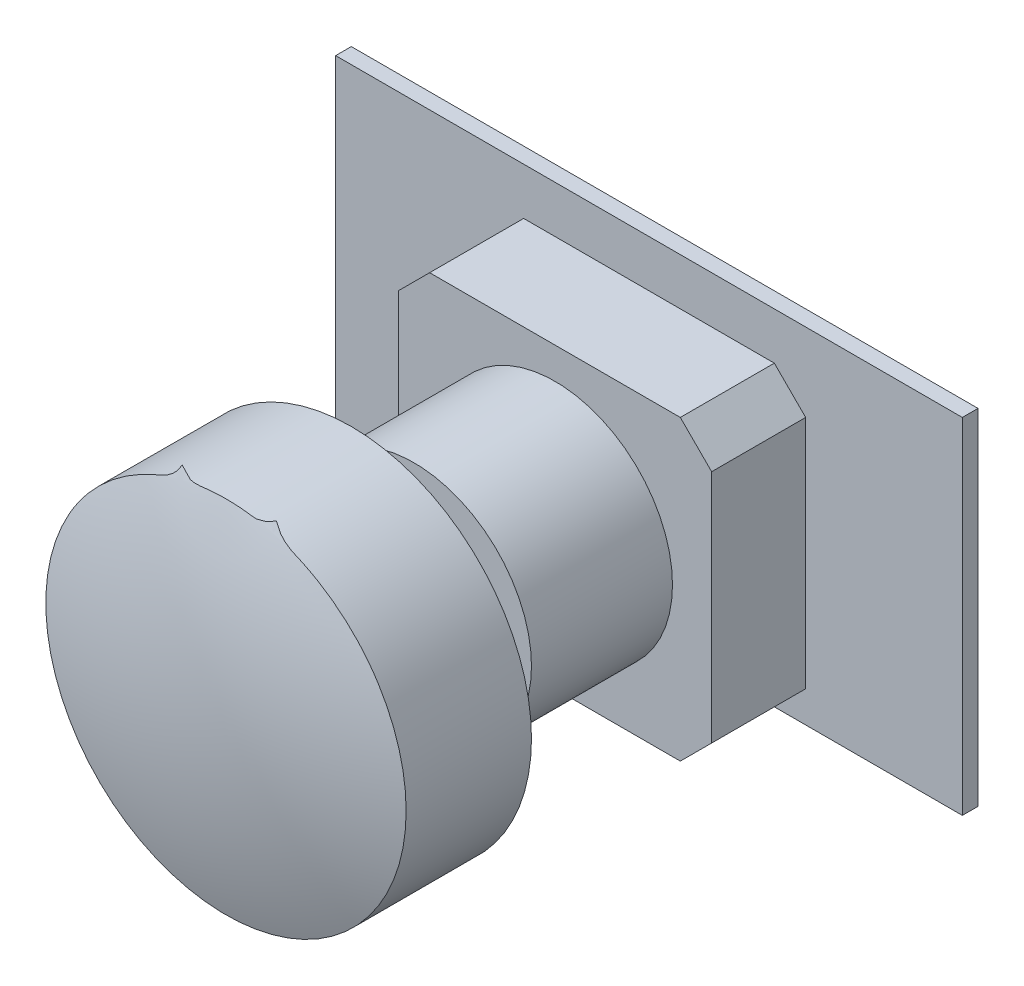
ISO-10303-21;
HEADER;
FILE_DESCRIPTION(('STEP AP214'),'2;1');
FILE_NAME('part.step','',(''),(''),'','','');
FILE_SCHEMA(('AUTOMOTIVE_DESIGN { 1 0 10303 214 1 1 1 1 }'));
ENDSEC;
DATA;
#1=APPLICATION_CONTEXT('core data for automotive mechanical design processes');
#2=APPLICATION_PROTOCOL_DEFINITION('international standard','automotive_design',2000,#1);
#3=PRODUCT_CONTEXT('',#1,'mechanical');
#4=PRODUCT('Part','Part','',(#3));
#5=PRODUCT_RELATED_PRODUCT_CATEGORY('part','',(#4));
#6=PRODUCT_DEFINITION_FORMATION('','',#4);
#7=PRODUCT_DEFINITION_CONTEXT('part definition',#1,'design');
#8=PRODUCT_DEFINITION('design','',#6,#7);
#9=PRODUCT_DEFINITION_SHAPE('','',#8);
#10=(LENGTH_UNIT() NAMED_UNIT(*) SI_UNIT(.MILLI.,.METRE.));
#11=(NAMED_UNIT(*) PLANE_ANGLE_UNIT() SI_UNIT($,.RADIAN.));
#12=(NAMED_UNIT(*) SI_UNIT($,.STERADIAN.) SOLID_ANGLE_UNIT());
#13=UNCERTAINTY_MEASURE_WITH_UNIT(LENGTH_MEASURE(1.E-05),#10,'distance_accuracy_value','');
#14=(GEOMETRIC_REPRESENTATION_CONTEXT(3) GLOBAL_UNCERTAINTY_ASSIGNED_CONTEXT((#13)) GLOBAL_UNIT_ASSIGNED_CONTEXT((#10,
#11,#12)) REPRESENTATION_CONTEXT('',''));
#15=CARTESIAN_POINT('',(0.,0.,0.));
#16=DIRECTION('',(0.,0.,1.));
#17=DIRECTION('',(1.,0.,0.));
#18=AXIS2_PLACEMENT_3D('',#15,#16,#17);
#19=CARTESIAN_POINT('',(20.,9.5,17.));
#20=DIRECTION('',(0.,0.,-1.));
#21=DIRECTION('',(-1.,0.,0.));
#22=AXIS2_PLACEMENT_3D('',#19,#20,#21);
#23=PLANE('',#22);
#24=CARTESIAN_POINT('',(20.,9.5,17.));
#25=DIRECTION('',(0.,0.,-1.));
#26=DIRECTION('',(-1.,0.,0.));
#27=AXIS2_PLACEMENT_3D('',#24,#25,#26);
#28=CIRCLE('',#27,6.);
#29=CARTESIAN_POINT('',(14.,9.5,17.));
#30=VERTEX_POINT('',#29);
#31=EDGE_CURVE('E196',#30,#30,#28,.T.);
#32=ORIENTED_EDGE('',*,*,#31,.T.);
#33=EDGE_LOOP('',(#32));
#34=FACE_BOUND('',#33,.T.);
#35=CARTESIAN_POINT('',(20.,9.5,17.));
#36=DIRECTION('',(0.,0.,-1.));
#37=DIRECTION('',(-1.,0.,0.));
#38=AXIS2_PLACEMENT_3D('',#35,#36,#37);
#39=CIRCLE('',#38,4.5);
#40=CARTESIAN_POINT('',(15.5,9.5,17.));
#41=VERTEX_POINT('',#40);
#42=EDGE_CURVE('E189',#41,#41,#39,.T.);
#43=ORIENTED_EDGE('',*,*,#42,.F.);
#44=EDGE_LOOP('',(#43));
#45=FACE_BOUND('',#44,.T.);
#46=ADVANCED_FACE('F45',(#34,#45),#23,.T.);
#47=CARTESIAN_POINT('',(20.,9.5,20.));
#48=DIRECTION('',(0.,0.,-1.));
#49=DIRECTION('',(-1.,0.,0.));
#50=AXIS2_PLACEMENT_3D('',#47,#48,#49);
#51=PLANE('',#50);
#52=CARTESIAN_POINT('',(20.,9.5,20.));
#53=DIRECTION('',(0.,0.,-1.));
#54=DIRECTION('',(-1.,0.,0.));
#55=AXIS2_PLACEMENT_3D('',#52,#53,#54);
#56=CIRCLE('',#55,11.5);
#57=CARTESIAN_POINT('',(8.49999999999999,9.5,20.));
#58=VERTEX_POINT('',#57);
#59=EDGE_CURVE('E199',#58,#58,#56,.T.);
#60=ORIENTED_EDGE('',*,*,#59,.T.);
#61=EDGE_LOOP('',(#60));
#62=FACE_BOUND('',#61,.T.);
#63=CARTESIAN_POINT('',(20.,9.5,20.));
#64=DIRECTION('',(0.,0.,-1.));
#65=DIRECTION('',(-1.,0.,0.));
#66=AXIS2_PLACEMENT_3D('',#63,#64,#65);
#67=CIRCLE('',#66,6.);
#68=CARTESIAN_POINT('',(14.,9.5,20.));
#69=VERTEX_POINT('',#68);
#70=EDGE_CURVE('E193',#69,#69,#67,.T.);
#71=ORIENTED_EDGE('',*,*,#70,.F.);
#72=EDGE_LOOP('',(#71));
#73=FACE_BOUND('',#72,.T.);
#74=ADVANCED_FACE('F218',(#62,#73),#51,.T.);
#75=CARTESIAN_POINT('',(20.,9.50000000000002,-5.51802680000016));
#76=DIRECTION('',(0.,0.330546873924251,0.94378957619742));
#77=DIRECTION('',(-1.,0.,0.));
#78=AXIS2_PLACEMENT_3D('',#75,#76,#77);
#79=SPHERICAL_SURFACE('',#78,35.4359721267179);
#80=CARTESIAN_POINT('',(20.,9.5,28.));
#81=DIRECTION('',(0.,0.,1.));
#82=DIRECTION('',(1.,0.,0.));
#83=AXIS2_PLACEMENT_3D('',#80,#81,#82);
#84=CIRCLE('',#83,11.5);
#85=CARTESIAN_POINT('',(31.5,9.5,28.));
#86=VERTEX_POINT('',#85);
#87=EDGE_CURVE('E204',#86,#86,#84,.F.);
#88=ORIENTED_EDGE('',*,*,#87,.F.);
#89=EDGE_LOOP('',(#88));
#90=FACE_BOUND('',#89,.T.);
#91=ADVANCED_FACE('F213',(#90),#79,.T.);
#92=CARTESIAN_POINT('',(20.,9.5,20.));
#93=DIRECTION('',(0.,0.,1.));
#94=DIRECTION('',(1.,0.,0.));
#95=AXIS2_PLACEMENT_3D('',#92,#93,#94);
#96=CYLINDRICAL_SURFACE('',#95,11.5);
#97=ORIENTED_EDGE('',*,*,#59,.F.);
#98=EDGE_LOOP('',(#97));
#99=FACE_BOUND('',#98,.T.);
#100=ORIENTED_EDGE('',*,*,#87,.T.);
#101=EDGE_LOOP('',(#100));
#102=FACE_BOUND('',#101,.T.);
#103=ADVANCED_FACE('F217',(#99,#102),#96,.T.);
#104=CARTESIAN_POINT('',(20.,9.5,17.));
#105=DIRECTION('',(0.,0.,1.));
#106=DIRECTION('',(1.,0.,0.));
#107=AXIS2_PLACEMENT_3D('',#104,#105,#106);
#108=CYLINDRICAL_SURFACE('',#107,6.);
#109=ORIENTED_EDGE('',*,*,#31,.F.);
#110=EDGE_LOOP('',(#109));
#111=FACE_BOUND('',#110,.T.);
#112=ORIENTED_EDGE('',*,*,#70,.T.);
#113=EDGE_LOOP('',(#112));
#114=FACE_BOUND('',#113,.T.);
#115=ADVANCED_FACE('F249',(#111,#114),#108,.T.);
#116=CARTESIAN_POINT('',(20.,9.5,16.));
#117=DIRECTION('',(0.,0.,1.));
#118=DIRECTION('',(1.,0.,0.));
#119=AXIS2_PLACEMENT_3D('',#116,#117,#118);
#120=CYLINDRICAL_SURFACE('',#119,4.5);
#121=CARTESIAN_POINT('',(20.,9.5,16.));
#122=DIRECTION('',(0.,0.,-1.));
#123=DIRECTION('',(-1.,0.,0.));
#124=AXIS2_PLACEMENT_3D('',#121,#122,#123);
#125=CIRCLE('',#124,4.5);
#126=CARTESIAN_POINT('',(15.5,9.5,16.));
#127=VERTEX_POINT('',#126);
#128=EDGE_CURVE('E190',#127,#127,#125,.T.);
#129=ORIENTED_EDGE('',*,*,#128,.F.);
#130=EDGE_LOOP('',(#129));
#131=FACE_BOUND('',#130,.T.);
#132=ORIENTED_EDGE('',*,*,#42,.T.);
#133=EDGE_LOOP('',(#132));
#134=FACE_BOUND('',#133,.T.);
#135=ADVANCED_FACE('F247',(#131,#134),#120,.T.);
#136=CARTESIAN_POINT('',(20.,9.5,16.));
#137=DIRECTION('',(0.,0.,-1.));
#138=DIRECTION('',(-1.,0.,0.));
#139=AXIS2_PLACEMENT_3D('',#136,#137,#138);
#140=PLANE('',#139);
#141=CARTESIAN_POINT('',(20.,9.5,16.));
#142=DIRECTION('',(0.,0.,1.));
#143=DIRECTION('',(-1.,0.,0.));
#144=AXIS2_PLACEMENT_3D('',#141,#142,#143);
#145=CIRCLE('',#144,7.5);
#146=CARTESIAN_POINT('',(12.5,9.5,16.));
#147=VERTEX_POINT('',#146);
#148=EDGE_CURVE('E186',#147,#147,#145,.T.);
#149=ORIENTED_EDGE('',*,*,#148,.T.);
#150=EDGE_LOOP('',(#149));
#151=FACE_BOUND('',#150,.T.);
#152=ORIENTED_EDGE('',*,*,#128,.T.);
#153=EDGE_LOOP('',(#152));
#154=FACE_BOUND('',#153,.T.);
#155=ADVANCED_FACE('F256',(#151,#154),#140,.F.);
#156=CARTESIAN_POINT('',(20.,9.5,7.));
#157=DIRECTION('',(0.,0.,1.));
#158=DIRECTION('',(1.,0.,0.));
#159=AXIS2_PLACEMENT_3D('',#156,#157,#158);
#160=CYLINDRICAL_SURFACE('',#159,7.5);
#161=CARTESIAN_POINT('',(20.,9.5,7.));
#162=DIRECTION('',(0.,0.,1.));
#163=DIRECTION('',(1.,0.,0.));
#164=AXIS2_PLACEMENT_3D('',#161,#162,#163);
#165=CIRCLE('',#164,7.5);
#166=CARTESIAN_POINT('',(27.5,9.5,7.));
#167=VERTEX_POINT('',#166);
#168=EDGE_CURVE('E183',#167,#167,#165,.F.);
#169=ORIENTED_EDGE('',*,*,#168,.F.);
#170=EDGE_LOOP('',(#169));
#171=FACE_BOUND('',#170,.T.);
#172=ORIENTED_EDGE('',*,*,#148,.F.);
#173=EDGE_LOOP('',(#172));
#174=FACE_BOUND('',#173,.T.);
#175=ADVANCED_FACE('F301',(#171,#174),#160,.T.);
#176=CARTESIAN_POINT('',(40.,19.,0.));
#177=DIRECTION('',(0.,1.,0.));
#178=DIRECTION('',(0.,0.,1.));
#179=AXIS2_PLACEMENT_3D('',#176,#177,#178);
#180=PLANE('',#179);
#181=DIRECTION('',(-1.,0.,0.));
#182=VECTOR('',#181,1.);
#183=CARTESIAN_POINT('',(40.,19.,7.));
#184=LINE('',#183,#182);
#185=CARTESIAN_POINT('',(28.,19.,7.));
#186=VERTEX_POINT('',#185);
#187=CARTESIAN_POINT('',(12.,19.,7.));
#188=VERTEX_POINT('',#187);
#189=EDGE_CURVE('E159',#186,#188,#184,.T.);
#190=ORIENTED_EDGE('',*,*,#189,.F.);
#191=DIRECTION('',(0.,0.,-1.));
#192=VECTOR('',#191,1.);
#193=CARTESIAN_POINT('',(28.,19.,1.));
#194=LINE('',#193,#192);
#195=CARTESIAN_POINT('',(28.,19.,1.));
#196=VERTEX_POINT('',#195);
#197=EDGE_CURVE('E60',#186,#196,#194,.T.);
#198=ORIENTED_EDGE('',*,*,#197,.T.);
#199=DIRECTION('',(1.,0.,0.));
#200=VECTOR('',#199,1.);
#201=CARTESIAN_POINT('',(40.,19.,1.));
#202=LINE('',#201,#200);
#203=CARTESIAN_POINT('',(12.,19.,1.));
#204=VERTEX_POINT('',#203);
#205=EDGE_CURVE('E166',#204,#196,#202,.T.);
#206=ORIENTED_EDGE('',*,*,#205,.F.);
#207=DIRECTION('',(0.,0.,1.));
#208=VECTOR('',#207,1.);
#209=CARTESIAN_POINT('',(12.,19.,0.));
#210=LINE('',#209,#208);
#211=EDGE_CURVE('E500',#204,#188,#210,.T.);
#212=ORIENTED_EDGE('',*,*,#211,.T.);
#213=EDGE_LOOP('',(#190,#198,#206,#212));
#214=FACE_BOUND('',#213,.T.);
#215=ADVANCED_FACE('F311',(#214),#180,.T.);
#216=CARTESIAN_POINT('',(40.,0.,0.));
#217=DIRECTION('',(1.,0.,0.));
#218=DIRECTION('',(0.,0.,-1.));
#219=AXIS2_PLACEMENT_3D('',#216,#217,#218);
#220=PLANE('',#219);
#221=DIRECTION('',(0.,0.,-1.));
#222=VECTOR('',#221,1.);
#223=CARTESIAN_POINT('',(40.,22.,0.));
#224=LINE('',#223,#222);
#225=CARTESIAN_POINT('',(40.,22.,1.));
#226=VERTEX_POINT('',#225);
#227=CARTESIAN_POINT('',(40.,22.,0.));
#228=VERTEX_POINT('',#227);
#229=EDGE_CURVE('E139',#226,#228,#224,.T.);
#230=ORIENTED_EDGE('',*,*,#229,.F.);
#231=DIRECTION('',(0.,1.,0.));
#232=VECTOR('',#231,1.);
#233=CARTESIAN_POINT('',(40.,-2.15420758550672,1.));
#234=LINE('',#233,#232);
#235=CARTESIAN_POINT('',(40.,0.,1.));
#236=VERTEX_POINT('',#235);
#237=EDGE_CURVE('E150',#236,#226,#234,.T.);
#238=ORIENTED_EDGE('',*,*,#237,.F.);
#239=DIRECTION('',(0.,0.,1.));
#240=VECTOR('',#239,1.);
#241=CARTESIAN_POINT('',(40.,0.,0.));
#242=LINE('',#241,#240);
#243=CARTESIAN_POINT('',(40.,0.,0.));
#244=VERTEX_POINT('',#243);
#245=EDGE_CURVE('E176',#244,#236,#242,.T.);
#246=ORIENTED_EDGE('',*,*,#245,.F.);
#247=DIRECTION('',(0.,1.,0.));
#248=VECTOR('',#247,1.);
#249=CARTESIAN_POINT('',(40.,0.,0.));
#250=LINE('',#249,#248);
#251=EDGE_CURVE('E153',#244,#228,#250,.T.);
#252=ORIENTED_EDGE('',*,*,#251,.T.);
#253=EDGE_LOOP('',(#230,#238,#246,#252));
#254=FACE_BOUND('',#253,.T.);
#255=ADVANCED_FACE('F149',(#254),#220,.T.);
#256=CARTESIAN_POINT('',(10.,0.,0.));
#257=DIRECTION('',(0.,-1.,0.));
#258=DIRECTION('',(1.,0.,0.));
#259=AXIS2_PLACEMENT_3D('',#256,#257,#258);
#260=PLANE('',#259);
#261=DIRECTION('',(1.,0.,0.));
#262=VECTOR('',#261,1.);
#263=CARTESIAN_POINT('',(10.,0.,7.));
#264=LINE('',#263,#262);
#265=CARTESIAN_POINT('',(12.,0.,7.));
#266=VERTEX_POINT('',#265);
#267=CARTESIAN_POINT('',(28.,0.,7.));
#268=VERTEX_POINT('',#267);
#269=EDGE_CURVE('E175',#266,#268,#264,.T.);
#270=ORIENTED_EDGE('',*,*,#269,.F.);
#271=DIRECTION('',(0.,0.,-1.));
#272=VECTOR('',#271,1.);
#273=CARTESIAN_POINT('',(12.,0.,0.));
#274=LINE('',#273,#272);
#275=CARTESIAN_POINT('',(12.,0.,1.));
#276=VERTEX_POINT('',#275);
#277=EDGE_CURVE('E490',#266,#276,#274,.T.);
#278=ORIENTED_EDGE('',*,*,#277,.T.);
#279=DIRECTION('',(1.,0.,0.));
#280=VECTOR('',#279,1.);
#281=CARTESIAN_POINT('',(0.,0.,1.));
#282=LINE('',#281,#280);
#283=CARTESIAN_POINT('',(0.,0.,1.));
#284=VERTEX_POINT('',#283);
#285=EDGE_CURVE('E144',#284,#276,#282,.T.);
#286=ORIENTED_EDGE('',*,*,#285,.F.);
#287=DIRECTION('',(0.,0.,1.));
#288=VECTOR('',#287,1.);
#289=CARTESIAN_POINT('',(0.,0.,1.));
#290=LINE('',#289,#288);
#291=CARTESIAN_POINT('',(0.,0.,0.));
#292=VERTEX_POINT('',#291);
#293=EDGE_CURVE('E480',#292,#284,#290,.T.);
#294=ORIENTED_EDGE('',*,*,#293,.F.);
#295=DIRECTION('',(1.,0.,0.));
#296=VECTOR('',#295,1.);
#297=CARTESIAN_POINT('',(10.,0.,0.));
#298=LINE('',#297,#296);
#299=EDGE_CURVE('E172',#292,#244,#298,.T.);
#300=ORIENTED_EDGE('',*,*,#299,.T.);
#301=ORIENTED_EDGE('',*,*,#245,.T.);
#302=DIRECTION('',(1.,0.,0.));
#303=VECTOR('',#302,1.);
#304=CARTESIAN_POINT('',(10.,0.,1.));
#305=LINE('',#304,#303);
#306=CARTESIAN_POINT('',(28.,0.,1.));
#307=VERTEX_POINT('',#306);
#308=EDGE_CURVE('E158',#307,#236,#305,.T.);
#309=ORIENTED_EDGE('',*,*,#308,.F.);
#310=DIRECTION('',(0.,0.,1.));
#311=VECTOR('',#310,1.);
#312=CARTESIAN_POINT('',(28.,0.,7.));
#313=LINE('',#312,#311);
#314=EDGE_CURVE('E492',#307,#268,#313,.T.);
#315=ORIENTED_EDGE('',*,*,#314,.T.);
#316=EDGE_LOOP('',(#270,#278,#286,#294,#300,#301,#309,#315));
#317=FACE_BOUND('',#316,.T.);
#318=ADVANCED_FACE('F339',(#317),#260,.T.);
#319=CARTESIAN_POINT('',(10.,19.,0.));
#320=DIRECTION('',(-1.,0.,0.));
#321=DIRECTION('',(0.,0.,1.));
#322=AXIS2_PLACEMENT_3D('',#319,#320,#321);
#323=PLANE('',#322);
#324=DIRECTION('',(0.,1.,0.));
#325=VECTOR('',#324,1.);
#326=CARTESIAN_POINT('',(10.,22.,0.999999999999997));
#327=LINE('',#326,#325);
#328=CARTESIAN_POINT('',(10.,1.99999999999997,1.));
#329=VERTEX_POINT('',#328);
#330=CARTESIAN_POINT('',(10.,17.,0.999999999999998));
#331=VERTEX_POINT('',#330);
#332=EDGE_CURVE('E154',#329,#331,#327,.T.);
#333=ORIENTED_EDGE('',*,*,#332,.F.);
#334=DIRECTION('',(0.,0.,1.));
#335=VECTOR('',#334,1.);
#336=CARTESIAN_POINT('',(10.,1.99999999999997,0.));
#337=LINE('',#336,#335);
#338=CARTESIAN_POINT('',(10.,1.99999999999998,7.));
#339=VERTEX_POINT('',#338);
#340=EDGE_CURVE('E496',#329,#339,#337,.T.);
#341=ORIENTED_EDGE('',*,*,#340,.T.);
#342=DIRECTION('',(0.,-1.,0.));
#343=VECTOR('',#342,1.);
#344=CARTESIAN_POINT('',(10.,19.,7.));
#345=LINE('',#344,#343);
#346=CARTESIAN_POINT('',(10.,17.,7.));
#347=VERTEX_POINT('',#346);
#348=EDGE_CURVE('E163',#347,#339,#345,.T.);
#349=ORIENTED_EDGE('',*,*,#348,.F.);
#350=DIRECTION('',(0.,0.,-1.));
#351=VECTOR('',#350,1.);
#352=CARTESIAN_POINT('',(10.,17.,0.));
#353=LINE('',#352,#351);
#354=EDGE_CURVE('E475',#347,#331,#353,.T.);
#355=ORIENTED_EDGE('',*,*,#354,.T.);
#356=EDGE_LOOP('',(#333,#341,#349,#355));
#357=FACE_BOUND('',#356,.T.);
#358=ADVANCED_FACE('F345',(#357),#323,.T.);
#359=CARTESIAN_POINT('',(0.,0.,0.));
#360=DIRECTION('',(0.,0.,1.));
#361=DIRECTION('',(1.,0.,0.));
#362=AXIS2_PLACEMENT_3D('',#359,#360,#361);
#363=PLANE('',#362);
#364=DIRECTION('',(1.,0.,0.));
#365=VECTOR('',#364,1.);
#366=CARTESIAN_POINT('',(0.,22.,0.));
#367=LINE('',#366,#365);
#368=CARTESIAN_POINT('',(0.,22.,0.));
#369=VERTEX_POINT('',#368);
#370=EDGE_CURVE('E145',#369,#228,#367,.T.);
#371=ORIENTED_EDGE('',*,*,#370,.T.);
#372=ORIENTED_EDGE('',*,*,#251,.F.);
#373=ORIENTED_EDGE('',*,*,#299,.F.);
#374=DIRECTION('',(0.,-1.,0.));
#375=VECTOR('',#374,1.);
#376=CARTESIAN_POINT('',(0.,0.,0.));
#377=LINE('',#376,#375);
#378=EDGE_CURVE('E462',#369,#292,#377,.T.);
#379=ORIENTED_EDGE('',*,*,#378,.F.);
#380=EDGE_LOOP('',(#371,#372,#373,#379));
#381=FACE_BOUND('',#380,.T.);
#382=ADVANCED_FACE('F359',(#381),#363,.F.);
#383=CARTESIAN_POINT('',(0.,0.,7.));
#384=DIRECTION('',(0.,0.,1.));
#385=DIRECTION('',(1.,0.,0.));
#386=AXIS2_PLACEMENT_3D('',#383,#384,#385);
#387=PLANE('',#386);
#388=ORIENTED_EDGE('',*,*,#348,.T.);
#389=DIRECTION('',(-0.707106781186554,0.707106781186542,0.));
#390=VECTOR('',#389,1.);
#391=CARTESIAN_POINT('',(5.99999999999991,6.00000000000001,7.));
#392=LINE('',#391,#390);
#393=EDGE_CURVE('E523',#339,#266,#392,.F.);
#394=ORIENTED_EDGE('',*,*,#393,.T.);
#395=ORIENTED_EDGE('',*,*,#269,.T.);
#396=DIRECTION('',(0.707106781186554,0.707106781186541,0.));
#397=VECTOR('',#396,1.);
#398=CARTESIAN_POINT('',(13.9999999999998,-14.,7.));
#399=LINE('',#398,#397);
#400=CARTESIAN_POINT('',(30.,1.99999999999998,7.));
#401=VERTEX_POINT('',#400);
#402=EDGE_CURVE('E521',#268,#401,#399,.T.);
#403=ORIENTED_EDGE('',*,*,#402,.T.);
#404=DIRECTION('',(0.,-1.,0.));
#405=VECTOR('',#404,1.);
#406=CARTESIAN_POINT('',(30.,0.,7.));
#407=LINE('',#406,#405);
#408=CARTESIAN_POINT('',(30.,17.,7.));
#409=VERTEX_POINT('',#408);
#410=EDGE_CURVE('E208',#409,#401,#407,.T.);
#411=ORIENTED_EDGE('',*,*,#410,.F.);
#412=DIRECTION('',(-0.707106781186554,0.707106781186541,0.));
#413=VECTOR('',#412,1.);
#414=CARTESIAN_POINT('',(23.4999999999998,23.5000000000002,7.));
#415=LINE('',#414,#413);
#416=EDGE_CURVE('E511',#409,#186,#415,.T.);
#417=ORIENTED_EDGE('',*,*,#416,.T.);
#418=ORIENTED_EDGE('',*,*,#189,.T.);
#419=DIRECTION('',(0.707106781186542,0.707106781186553,0.));
#420=VECTOR('',#419,1.);
#421=CARTESIAN_POINT('',(-3.49999999999991,3.49999999999986,7.));
#422=LINE('',#421,#420);
#423=EDGE_CURVE('E519',#188,#347,#422,.F.);
#424=ORIENTED_EDGE('',*,*,#423,.T.);
#425=EDGE_LOOP('',(#388,#394,#395,#403,#411,#417,#418,#424));
#426=FACE_BOUND('',#425,.T.);
#427=ORIENTED_EDGE('',*,*,#168,.T.);
#428=EDGE_LOOP('',(#427));
#429=FACE_BOUND('',#428,.T.);
#430=ADVANCED_FACE('F369',(#426,#429),#387,.T.);
#431=CARTESIAN_POINT('',(40.,-2.15420758550672,1.));
#432=DIRECTION('',(0.,0.,-1.));
#433=DIRECTION('',(-1.,0.,0.));
#434=AXIS2_PLACEMENT_3D('',#431,#432,#433);
#435=PLANE('',#434);
#436=ORIENTED_EDGE('',*,*,#237,.T.);
#437=DIRECTION('',(1.,0.,0.));
#438=VECTOR('',#437,1.);
#439=CARTESIAN_POINT('',(0.,22.,0.999999999999997));
#440=LINE('',#439,#438);
#441=CARTESIAN_POINT('',(0.,22.,0.999999999999997));
#442=VERTEX_POINT('',#441);
#443=EDGE_CURVE('E135',#442,#226,#440,.T.);
#444=ORIENTED_EDGE('',*,*,#443,.F.);
#445=DIRECTION('',(0.,1.,0.));
#446=VECTOR('',#445,1.);
#447=CARTESIAN_POINT('',(0.,22.,0.999999999999997));
#448=LINE('',#447,#446);
#449=EDGE_CURVE('E464',#284,#442,#448,.T.);
#450=ORIENTED_EDGE('',*,*,#449,.F.);
#451=ORIENTED_EDGE('',*,*,#285,.T.);
#452=DIRECTION('',(0.707106781186554,-0.707106781186542,0.));
#453=VECTOR('',#452,1.);
#454=CARTESIAN_POINT('',(27.0771037927536,-15.0771037927533,1.));
#455=LINE('',#454,#453);
#456=EDGE_CURVE('E486',#276,#329,#455,.F.);
#457=ORIENTED_EDGE('',*,*,#456,.T.);
#458=ORIENTED_EDGE('',*,*,#332,.T.);
#459=DIRECTION('',(-0.707106781186542,-0.707106781186553,0.));
#460=VECTOR('',#459,1.);
#461=CARTESIAN_POINT('',(15.4228962072464,22.4228962072465,1.));
#462=LINE('',#461,#460);
#463=EDGE_CURVE('E12',#331,#204,#462,.F.);
#464=ORIENTED_EDGE('',*,*,#463,.T.);
#465=ORIENTED_EDGE('',*,*,#205,.T.);
#466=DIRECTION('',(0.707106781186554,-0.707106781186541,0.));
#467=VECTOR('',#466,1.);
#468=CARTESIAN_POINT('',(44.5771037927535,2.42289620724682,1.));
#469=LINE('',#468,#467);
#470=CARTESIAN_POINT('',(30.,17.,1.));
#471=VERTEX_POINT('',#470);
#472=EDGE_CURVE('E53',#196,#471,#469,.T.);
#473=ORIENTED_EDGE('',*,*,#472,.T.);
#474=DIRECTION('',(0.,1.,0.));
#475=VECTOR('',#474,1.);
#476=CARTESIAN_POINT('',(30.,-2.15420758550672,1.));
#477=LINE('',#476,#475);
#478=CARTESIAN_POINT('',(30.,1.99999999999997,1.));
#479=VERTEX_POINT('',#478);
#480=EDGE_CURVE('E160',#479,#471,#477,.T.);
#481=ORIENTED_EDGE('',*,*,#480,.F.);
#482=DIRECTION('',(-0.707106781186554,-0.707106781186541,0.));
#483=VECTOR('',#482,1.);
#484=CARTESIAN_POINT('',(32.9228962072467,4.92289620724666,1.));
#485=LINE('',#484,#483);
#486=EDGE_CURVE('E497',#479,#307,#485,.T.);
#487=ORIENTED_EDGE('',*,*,#486,.T.);
#488=ORIENTED_EDGE('',*,*,#308,.T.);
#489=EDGE_LOOP('',(#436,#444,#450,#451,#457,#458,#464,#465,#473,#481,#487,#488));
#490=FACE_BOUND('',#489,.T.);
#491=ADVANCED_FACE('F156',(#490),#435,.F.);
#492=CARTESIAN_POINT('',(30.,-2.15420758550672,1.));
#493=DIRECTION('',(-1.,0.,0.));
#494=DIRECTION('',(0.,0.,1.));
#495=AXIS2_PLACEMENT_3D('',#492,#493,#494);
#496=PLANE('',#495);
#497=ORIENTED_EDGE('',*,*,#410,.T.);
#498=DIRECTION('',(0.,0.,-1.));
#499=VECTOR('',#498,1.);
#500=CARTESIAN_POINT('',(30.,1.99999999999997,1.));
#501=LINE('',#500,#499);
#502=EDGE_CURVE('E510',#401,#479,#501,.T.);
#503=ORIENTED_EDGE('',*,*,#502,.T.);
#504=ORIENTED_EDGE('',*,*,#480,.T.);
#505=DIRECTION('',(0.,0.,1.));
#506=VECTOR('',#505,1.);
#507=CARTESIAN_POINT('',(30.,17.,7.));
#508=LINE('',#507,#506);
#509=EDGE_CURVE('E491',#471,#409,#508,.T.);
#510=ORIENTED_EDGE('',*,*,#509,.T.);
#511=EDGE_LOOP('',(#497,#503,#504,#510));
#512=FACE_BOUND('',#511,.T.);
#513=ADVANCED_FACE('F382',(#512),#496,.F.);
#514=CARTESIAN_POINT('',(0.,22.,0.));
#515=DIRECTION('',(0.,-1.,0.));
#516=DIRECTION('',(0.,0.,-1.));
#517=AXIS2_PLACEMENT_3D('',#514,#515,#516);
#518=PLANE('',#517);
#519=ORIENTED_EDGE('',*,*,#443,.T.);
#520=ORIENTED_EDGE('',*,*,#229,.T.);
#521=ORIENTED_EDGE('',*,*,#370,.F.);
#522=DIRECTION('',(0.,0.,-1.));
#523=VECTOR('',#522,1.);
#524=CARTESIAN_POINT('',(0.,22.,0.));
#525=LINE('',#524,#523);
#526=EDGE_CURVE('E141',#442,#369,#525,.T.);
#527=ORIENTED_EDGE('',*,*,#526,.F.);
#528=EDGE_LOOP('',(#519,#520,#521,#527));
#529=FACE_BOUND('',#528,.T.);
#530=ADVANCED_FACE('F137',(#529),#518,.F.);
#531=CARTESIAN_POINT('',(0.,0.,0.));
#532=DIRECTION('',(1.,0.,0.));
#533=DIRECTION('',(0.,0.,-1.));
#534=AXIS2_PLACEMENT_3D('',#531,#532,#533);
#535=PLANE('',#534);
#536=ORIENTED_EDGE('',*,*,#378,.T.);
#537=ORIENTED_EDGE('',*,*,#293,.T.);
#538=ORIENTED_EDGE('',*,*,#449,.T.);
#539=ORIENTED_EDGE('',*,*,#526,.T.);
#540=EDGE_LOOP('',(#536,#537,#538,#539));
#541=FACE_BOUND('',#540,.T.);
#542=ADVANCED_FACE('F225',(#541),#535,.F.);
#543=CARTESIAN_POINT('',(10.,1.99999999999997,0.));
#544=DIRECTION('',(0.707106781186542,0.707106781186554,0.));
#545=DIRECTION('',(0.,0.,1.));
#546=AXIS2_PLACEMENT_3D('',#543,#544,#545);
#547=PLANE('',#546);
#548=ORIENTED_EDGE('',*,*,#456,.F.);
#549=ORIENTED_EDGE('',*,*,#277,.F.);
#550=ORIENTED_EDGE('',*,*,#393,.F.);
#551=ORIENTED_EDGE('',*,*,#340,.F.);
#552=EDGE_LOOP('',(#548,#549,#550,#551));
#553=FACE_BOUND('',#552,.T.);
#554=ADVANCED_FACE('F221',(#553),#547,.F.);
#555=CARTESIAN_POINT('',(30.,1.99999999999997,1.));
#556=DIRECTION('',(0.707106781186541,-0.707106781186554,0.));
#557=DIRECTION('',(0.,0.,1.));
#558=AXIS2_PLACEMENT_3D('',#555,#556,#557);
#559=PLANE('',#558);
#560=ORIENTED_EDGE('',*,*,#402,.F.);
#561=ORIENTED_EDGE('',*,*,#314,.F.);
#562=ORIENTED_EDGE('',*,*,#486,.F.);
#563=ORIENTED_EDGE('',*,*,#502,.F.);
#564=EDGE_LOOP('',(#560,#561,#562,#563));
#565=FACE_BOUND('',#564,.T.);
#566=ADVANCED_FACE('F224',(#565),#559,.T.);
#567=CARTESIAN_POINT('',(30.,17.,1.));
#568=DIRECTION('',(0.707106781186541,0.707106781186554,0.));
#569=DIRECTION('',(0.,0.,-1.));
#570=AXIS2_PLACEMENT_3D('',#567,#568,#569);
#571=PLANE('',#570);
#572=ORIENTED_EDGE('',*,*,#472,.F.);
#573=ORIENTED_EDGE('',*,*,#197,.F.);
#574=ORIENTED_EDGE('',*,*,#416,.F.);
#575=ORIENTED_EDGE('',*,*,#509,.F.);
#576=EDGE_LOOP('',(#572,#573,#574,#575));
#577=FACE_BOUND('',#576,.T.);
#578=ADVANCED_FACE('F228',(#577),#571,.T.);
#579=CARTESIAN_POINT('',(12.,19.,0.));
#580=DIRECTION('',(0.707106781186553,-0.707106781186542,0.));
#581=DIRECTION('',(0.,0.,1.));
#582=AXIS2_PLACEMENT_3D('',#579,#580,#581);
#583=PLANE('',#582);
#584=ORIENTED_EDGE('',*,*,#463,.F.);
#585=ORIENTED_EDGE('',*,*,#354,.F.);
#586=ORIENTED_EDGE('',*,*,#423,.F.);
#587=ORIENTED_EDGE('',*,*,#211,.F.);
#588=EDGE_LOOP('',(#584,#585,#586,#587));
#589=FACE_BOUND('',#588,.T.);
#590=ADVANCED_FACE('F47',(#589),#583,.F.);
#591=CLOSED_SHELL('',(#46,#74,#91,#103,#115,#135,#155,#175,#215,#255,#318,#358,#382,#430,#491,
#513,#530,#542,#554,#566,#578,#590));
#592=MANIFOLD_SOLID_BREP('B2',#591);
#593=ADVANCED_BREP_SHAPE_REPRESENTATION('',(#18,#592),#14);
#594=SHAPE_DEFINITION_REPRESENTATION(#9,#593);
ENDSEC;
END-ISO-10303-21;
